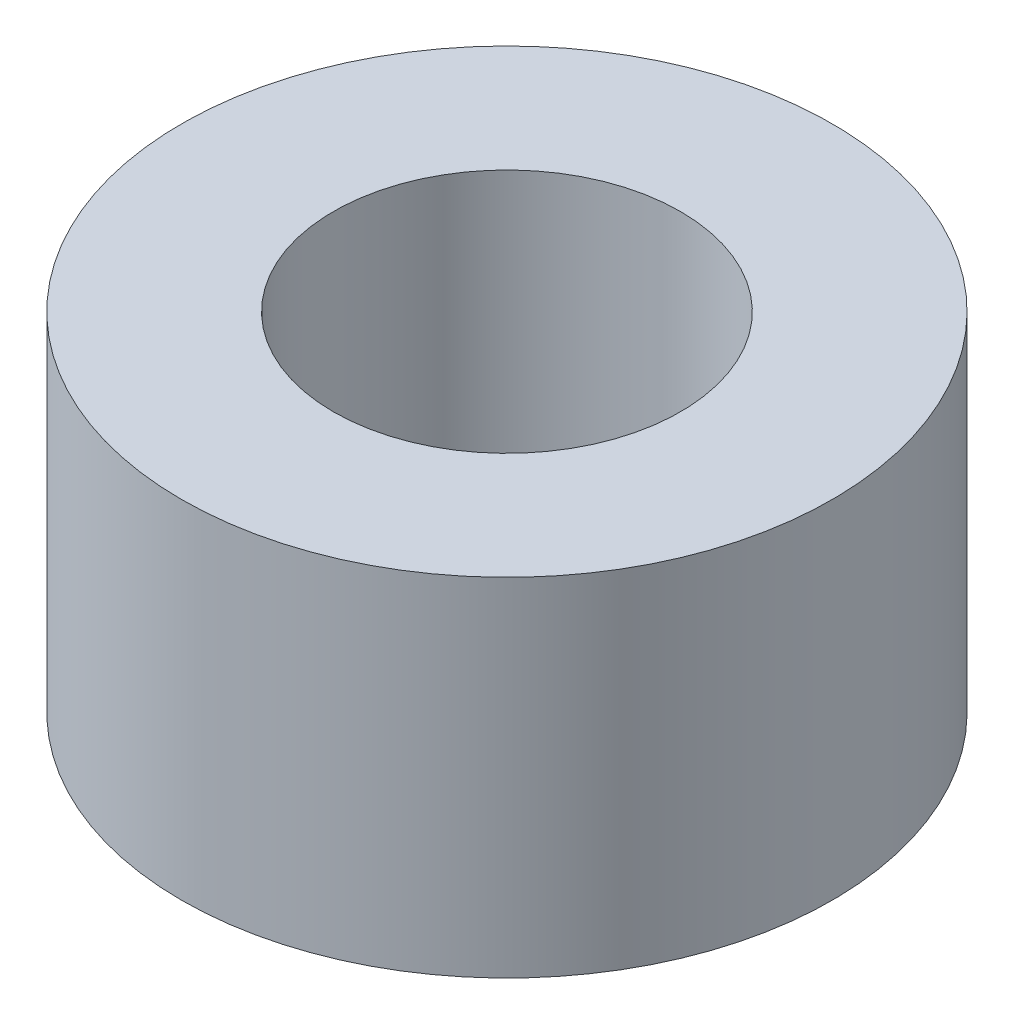
ISO-10303-21;
HEADER;
FILE_DESCRIPTION(('STEP AP214'),'2;1');
FILE_NAME('part.step','',(''),(''),'','','');
FILE_SCHEMA(('AUTOMOTIVE_DESIGN { 1 0 10303 214 1 1 1 1 }'));
ENDSEC;
DATA;
#1=APPLICATION_CONTEXT('core data for automotive mechanical design processes');
#2=APPLICATION_PROTOCOL_DEFINITION('international standard','automotive_design',2000,#1);
#3=PRODUCT_CONTEXT('',#1,'mechanical');
#4=PRODUCT('Part','Part','',(#3));
#5=PRODUCT_RELATED_PRODUCT_CATEGORY('part','',(#4));
#6=PRODUCT_DEFINITION_FORMATION('','',#4);
#7=PRODUCT_DEFINITION_CONTEXT('part definition',#1,'design');
#8=PRODUCT_DEFINITION('design','',#6,#7);
#9=PRODUCT_DEFINITION_SHAPE('','',#8);
#10=(LENGTH_UNIT() NAMED_UNIT(*) SI_UNIT(.MILLI.,.METRE.));
#11=(NAMED_UNIT(*) PLANE_ANGLE_UNIT() SI_UNIT($,.RADIAN.));
#12=(NAMED_UNIT(*) SI_UNIT($,.STERADIAN.) SOLID_ANGLE_UNIT());
#13=UNCERTAINTY_MEASURE_WITH_UNIT(LENGTH_MEASURE(1.E-05),#10,'distance_accuracy_value','');
#14=(GEOMETRIC_REPRESENTATION_CONTEXT(3) GLOBAL_UNCERTAINTY_ASSIGNED_CONTEXT((#13)) GLOBAL_UNIT_ASSIGNED_CONTEXT((#10,
#11,#12)) REPRESENTATION_CONTEXT('',''));
#15=CARTESIAN_POINT('',(0.,0.,0.));
#16=DIRECTION('',(0.,0.,1.));
#17=DIRECTION('',(1.,0.,0.));
#18=AXIS2_PLACEMENT_3D('',#15,#16,#17);
#19=CARTESIAN_POINT('',(0.,12.7,0.));
#20=DIRECTION('',(0.,1.,0.));
#21=DIRECTION('',(0.,0.,1.));
#22=AXIS2_PLACEMENT_3D('',#19,#20,#21);
#23=PLANE('',#22);
#24=CARTESIAN_POINT('',(0.,12.7,0.));
#25=DIRECTION('',(0.,1.,0.));
#26=DIRECTION('',(0.,0.,1.));
#27=AXIS2_PLACEMENT_3D('',#24,#25,#26);
#28=CIRCLE('',#27,11.90625);
#29=CARTESIAN_POINT('',(0.,12.7,11.90625));
#30=VERTEX_POINT('',#29);
#31=EDGE_CURVE('E10',#30,#30,#28,.T.);
#32=ORIENTED_EDGE('',*,*,#31,.T.);
#33=EDGE_LOOP('',(#32));
#34=FACE_BOUND('',#33,.T.);
#35=CARTESIAN_POINT('',(0.,12.7,0.));
#36=DIRECTION('',(0.,1.,0.));
#37=DIRECTION('',(0.,0.,1.));
#38=AXIS2_PLACEMENT_3D('',#35,#36,#37);
#39=CIRCLE('',#38,6.35);
#40=CARTESIAN_POINT('',(0.,12.7,6.35));
#41=VERTEX_POINT('',#40);
#42=EDGE_CURVE('E42',#41,#41,#39,.T.);
#43=ORIENTED_EDGE('',*,*,#42,.F.);
#44=EDGE_LOOP('',(#43));
#45=FACE_BOUND('',#44,.T.);
#46=ADVANCED_FACE('F31',(#34,#45),#23,.T.);
#47=CARTESIAN_POINT('',(0.,0.,0.));
#48=DIRECTION('',(0.,1.,0.));
#49=DIRECTION('',(0.,0.,1.));
#50=AXIS2_PLACEMENT_3D('',#47,#48,#49);
#51=PLANE('',#50);
#52=CARTESIAN_POINT('',(0.,0.,0.));
#53=DIRECTION('',(0.,1.,0.));
#54=DIRECTION('',(0.,0.,1.));
#55=AXIS2_PLACEMENT_3D('',#52,#53,#54);
#56=CIRCLE('',#55,11.90625);
#57=CARTESIAN_POINT('',(0.,0.,11.90625));
#58=VERTEX_POINT('',#57);
#59=EDGE_CURVE('E35',#58,#58,#56,.T.);
#60=ORIENTED_EDGE('',*,*,#59,.F.);
#61=EDGE_LOOP('',(#60));
#62=FACE_BOUND('',#61,.T.);
#63=CARTESIAN_POINT('',(0.,0.,0.));
#64=DIRECTION('',(0.,1.,0.));
#65=DIRECTION('',(0.,0.,1.));
#66=AXIS2_PLACEMENT_3D('',#63,#64,#65);
#67=CIRCLE('',#66,6.35);
#68=CARTESIAN_POINT('',(0.,0.,6.35));
#69=VERTEX_POINT('',#68);
#70=EDGE_CURVE('E44',#69,#69,#67,.T.);
#71=ORIENTED_EDGE('',*,*,#70,.T.);
#72=EDGE_LOOP('',(#71));
#73=FACE_BOUND('',#72,.T.);
#74=ADVANCED_FACE('F54',(#62,#73),#51,.F.);
#75=CARTESIAN_POINT('',(0.,12.7,0.));
#76=DIRECTION('',(0.,-1.,0.));
#77=DIRECTION('',(0.,0.,-1.));
#78=AXIS2_PLACEMENT_3D('',#75,#76,#77);
#79=CYLINDRICAL_SURFACE('',#78,11.90625);
#80=ORIENTED_EDGE('',*,*,#31,.F.);
#81=EDGE_LOOP('',(#80));
#82=FACE_BOUND('',#81,.T.);
#83=ORIENTED_EDGE('',*,*,#59,.T.);
#84=EDGE_LOOP('',(#83));
#85=FACE_BOUND('',#84,.T.);
#86=ADVANCED_FACE('F33',(#82,#85),#79,.T.);
#87=CARTESIAN_POINT('',(0.,12.7,0.));
#88=DIRECTION('',(0.,-1.,0.));
#89=DIRECTION('',(0.,0.,-1.));
#90=AXIS2_PLACEMENT_3D('',#87,#88,#89);
#91=CYLINDRICAL_SURFACE('',#90,6.35);
#92=ORIENTED_EDGE('',*,*,#42,.T.);
#93=EDGE_LOOP('',(#92));
#94=FACE_BOUND('',#93,.T.);
#95=ORIENTED_EDGE('',*,*,#70,.F.);
#96=EDGE_LOOP('',(#95));
#97=FACE_BOUND('',#96,.T.);
#98=ADVANCED_FACE('F50',(#94,#97),#91,.F.);
#99=CLOSED_SHELL('',(#46,#74,#86,#98));
#100=MANIFOLD_SOLID_BREP('B2',#99);
#101=ADVANCED_BREP_SHAPE_REPRESENTATION('',(#18,#100),#14);
#102=SHAPE_DEFINITION_REPRESENTATION(#9,#101);
ENDSEC;
END-ISO-10303-21;
